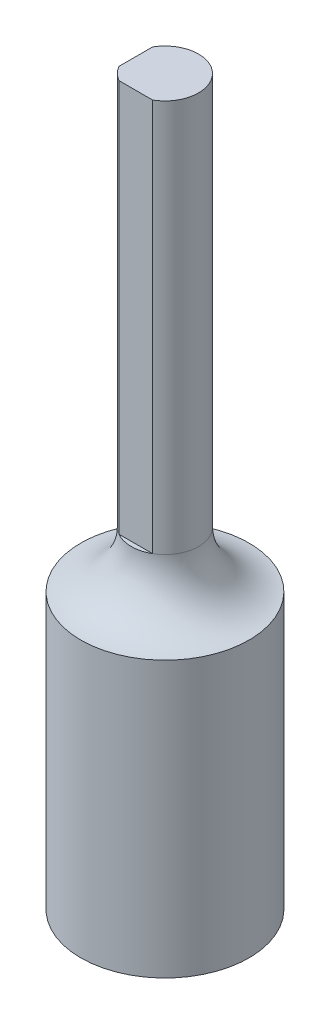
ISO-10303-21;
HEADER;
FILE_DESCRIPTION(('STEP AP214'),'2;1');
FILE_NAME('part.step','',(''),(''),'','','');
FILE_SCHEMA(('AUTOMOTIVE_DESIGN { 1 0 10303 214 1 1 1 1 }'));
ENDSEC;
DATA;
#1=APPLICATION_CONTEXT('core data for automotive mechanical design processes');
#2=APPLICATION_PROTOCOL_DEFINITION('international standard','automotive_design',2000,#1);
#3=PRODUCT_CONTEXT('',#1,'mechanical');
#4=PRODUCT('Part','Part','',(#3));
#5=PRODUCT_RELATED_PRODUCT_CATEGORY('part','',(#4));
#6=PRODUCT_DEFINITION_FORMATION('','',#4);
#7=PRODUCT_DEFINITION_CONTEXT('part definition',#1,'design');
#8=PRODUCT_DEFINITION('design','',#6,#7);
#9=PRODUCT_DEFINITION_SHAPE('','',#8);
#10=(LENGTH_UNIT() NAMED_UNIT(*) SI_UNIT(.MILLI.,.METRE.));
#11=(NAMED_UNIT(*) PLANE_ANGLE_UNIT() SI_UNIT($,.RADIAN.));
#12=(NAMED_UNIT(*) SI_UNIT($,.STERADIAN.) SOLID_ANGLE_UNIT());
#13=UNCERTAINTY_MEASURE_WITH_UNIT(LENGTH_MEASURE(1.E-05),#10,'distance_accuracy_value','');
#14=(GEOMETRIC_REPRESENTATION_CONTEXT(3) GLOBAL_UNCERTAINTY_ASSIGNED_CONTEXT((#13)) GLOBAL_UNIT_ASSIGNED_CONTEXT((#10,
#11,#12)) REPRESENTATION_CONTEXT('',''));
#15=CARTESIAN_POINT('',(0.,0.,0.));
#16=DIRECTION('',(0.,0.,1.));
#17=DIRECTION('',(1.,0.,0.));
#18=AXIS2_PLACEMENT_3D('',#15,#16,#17);
#19=CARTESIAN_POINT('',(0.,64.54,0.));
#20=DIRECTION('',(0.,-1.,0.));
#21=DIRECTION('',(0.,0.,-1.));
#22=AXIS2_PLACEMENT_3D('',#19,#20,#21);
#23=CYLINDRICAL_SURFACE('',#22,3.);
#24=CARTESIAN_POINT('',(0.,29.5149371855331,0.));
#25=DIRECTION('',(0.,-1.,0.));
#26=DIRECTION('',(0.,0.,-1.));
#27=AXIS2_PLACEMENT_3D('',#24,#25,#26);
#28=CIRCLE('',#27,3.);
#29=CARTESIAN_POINT('',(-2.6,29.5149371855331,1.49666295470958));
#30=VERTEX_POINT('',#29);
#31=CARTESIAN_POINT('',(-1.49666295470957,29.5149371855331,2.60000000000001));
#32=VERTEX_POINT('',#31);
#33=EDGE_CURVE('E51',#30,#32,#28,.F.);
#34=ORIENTED_EDGE('',*,*,#33,.T.);
#35=DIRECTION('',(0.,-1.,0.));
#36=VECTOR('',#35,1.);
#37=CARTESIAN_POINT('',(-1.49666295470957,64.54,2.60000000000001));
#38=LINE('',#37,#36);
#39=CARTESIAN_POINT('',(-1.49666295470957,64.54,2.60000000000001));
#40=VERTEX_POINT('',#39);
#41=EDGE_CURVE('E117',#32,#40,#38,.F.);
#42=ORIENTED_EDGE('',*,*,#41,.T.);
#43=CARTESIAN_POINT('',(0.,64.54,0.));
#44=DIRECTION('',(0.,1.,0.));
#45=DIRECTION('',(0.,0.,1.));
#46=AXIS2_PLACEMENT_3D('',#43,#44,#45);
#47=CIRCLE('',#46,3.);
#48=CARTESIAN_POINT('',(-2.6,64.54,1.49666295470958));
#49=VERTEX_POINT('',#48);
#50=EDGE_CURVE('E139',#49,#40,#47,.T.);
#51=ORIENTED_EDGE('',*,*,#50,.F.);
#52=DIRECTION('',(0.,-1.,0.));
#53=VECTOR('',#52,1.);
#54=CARTESIAN_POINT('',(-2.6,64.54,1.49666295470958));
#55=LINE('',#54,#53);
#56=EDGE_CURVE('E138',#49,#30,#55,.T.);
#57=ORIENTED_EDGE('',*,*,#56,.T.);
#58=EDGE_LOOP('',(#34,#42,#51,#57));
#59=FACE_BOUND('',#58,.T.);
#60=ADVANCED_FACE('F43',(#59),#23,.T.);
#61=CARTESIAN_POINT('',(0.,22.,0.));
#62=DIRECTION('',(0.,-1.,0.));
#63=DIRECTION('',(0.,0.,-1.));
#64=AXIS2_PLACEMENT_3D('',#61,#62,#63);
#65=CYLINDRICAL_SURFACE('',#64,4.005);
#66=CARTESIAN_POINT('',(0.,0.,0.));
#67=DIRECTION('',(0.,1.,0.));
#68=DIRECTION('',(0.,0.,1.));
#69=AXIS2_PLACEMENT_3D('',#66,#67,#68);
#70=CIRCLE('',#69,4.005);
#71=CARTESIAN_POINT('',(-1.52,0.,-3.70535086057987));
#72=VERTEX_POINT('',#71);
#73=CARTESIAN_POINT('',(1.52,0.,-3.70535086057987));
#74=VERTEX_POINT('',#73);
#75=EDGE_CURVE('E161',#72,#74,#70,.T.);
#76=ORIENTED_EDGE('',*,*,#75,.F.);
#77=DIRECTION('',(0.,-1.,0.));
#78=VECTOR('',#77,1.);
#79=CARTESIAN_POINT('',(-1.52,22.,-3.70535086057987));
#80=LINE('',#79,#78);
#81=CARTESIAN_POINT('',(-1.52,22.,-3.70535086057987));
#82=VERTEX_POINT('',#81);
#83=EDGE_CURVE('E91',#82,#72,#80,.T.);
#84=ORIENTED_EDGE('',*,*,#83,.F.);
#85=CARTESIAN_POINT('',(0.,22.,0.));
#86=DIRECTION('',(0.,1.,0.));
#87=DIRECTION('',(0.,0.,1.));
#88=AXIS2_PLACEMENT_3D('',#85,#86,#87);
#89=CIRCLE('',#88,4.005);
#90=CARTESIAN_POINT('',(1.52,22.,-3.70535086057987));
#91=VERTEX_POINT('',#90);
#92=EDGE_CURVE('E162',#82,#91,#89,.T.);
#93=ORIENTED_EDGE('',*,*,#92,.T.);
#94=DIRECTION('',(0.,-1.,0.));
#95=VECTOR('',#94,1.);
#96=CARTESIAN_POINT('',(1.52,22.,-3.70535086057987));
#97=LINE('',#96,#95);
#98=EDGE_CURVE('E88',#91,#74,#97,.T.);
#99=ORIENTED_EDGE('',*,*,#98,.T.);
#100=EDGE_LOOP('',(#76,#84,#93,#99));
#101=FACE_BOUND('',#100,.T.);
#102=ADVANCED_FACE('F192',(#101),#65,.F.);
#103=CARTESIAN_POINT('',(-1.52,22.,0.));
#104=DIRECTION('',(1.,0.,0.));
#105=DIRECTION('',(0.,0.,-1.));
#106=AXIS2_PLACEMENT_3D('',#103,#104,#105);
#107=PLANE('',#106);
#108=DIRECTION('',(0.,0.,1.));
#109=VECTOR('',#108,1.);
#110=CARTESIAN_POINT('',(-1.52,0.,0.));
#111=LINE('',#110,#109);
#112=CARTESIAN_POINT('',(-1.52,0.,-5.24));
#113=VERTEX_POINT('',#112);
#114=EDGE_CURVE('E175',#113,#72,#111,.T.);
#115=ORIENTED_EDGE('',*,*,#114,.F.);
#116=DIRECTION('',(0.,-1.,0.));
#117=VECTOR('',#116,1.);
#118=CARTESIAN_POINT('',(-1.52,22.,-5.24));
#119=LINE('',#118,#117);
#120=CARTESIAN_POINT('',(-1.52,22.,-5.24));
#121=VERTEX_POINT('',#120);
#122=EDGE_CURVE('E186',#121,#113,#119,.T.);
#123=ORIENTED_EDGE('',*,*,#122,.F.);
#124=DIRECTION('',(0.,0.,1.));
#125=VECTOR('',#124,1.);
#126=CARTESIAN_POINT('',(-1.52,22.,0.));
#127=LINE('',#126,#125);
#128=EDGE_CURVE('E164',#121,#82,#127,.T.);
#129=ORIENTED_EDGE('',*,*,#128,.T.);
#130=ORIENTED_EDGE('',*,*,#83,.T.);
#131=EDGE_LOOP('',(#115,#123,#129,#130));
#132=FACE_BOUND('',#131,.T.);
#133=ADVANCED_FACE('F189',(#132),#107,.T.);
#134=CARTESIAN_POINT('',(0.,22.,-5.24));
#135=DIRECTION('',(0.,0.,-1.));
#136=DIRECTION('',(-1.,0.,0.));
#137=AXIS2_PLACEMENT_3D('',#134,#135,#136);
#138=PLANE('',#137);
#139=DIRECTION('',(1.,0.,0.));
#140=VECTOR('',#139,1.);
#141=CARTESIAN_POINT('',(0.,0.,-5.24));
#142=LINE('',#141,#140);
#143=CARTESIAN_POINT('',(1.52,0.,-5.24));
#144=VERTEX_POINT('',#143);
#145=EDGE_CURVE('E178',#113,#144,#142,.T.);
#146=ORIENTED_EDGE('',*,*,#145,.T.);
#147=DIRECTION('',(0.,-1.,0.));
#148=VECTOR('',#147,1.);
#149=CARTESIAN_POINT('',(1.52,22.,-5.24));
#150=LINE('',#149,#148);
#151=CARTESIAN_POINT('',(1.52,22.,-5.24));
#152=VERTEX_POINT('',#151);
#153=EDGE_CURVE('E67',#152,#144,#150,.T.);
#154=ORIENTED_EDGE('',*,*,#153,.F.);
#155=DIRECTION('',(1.,0.,0.));
#156=VECTOR('',#155,1.);
#157=CARTESIAN_POINT('',(0.,22.,-5.24));
#158=LINE('',#157,#156);
#159=EDGE_CURVE('E167',#121,#152,#158,.T.);
#160=ORIENTED_EDGE('',*,*,#159,.F.);
#161=ORIENTED_EDGE('',*,*,#122,.T.);
#162=EDGE_LOOP('',(#146,#154,#160,#161));
#163=FACE_BOUND('',#162,.T.);
#164=ADVANCED_FACE('F198',(#163),#138,.F.);
#165=CARTESIAN_POINT('',(1.52,22.,0.));
#166=DIRECTION('',(1.,0.,0.));
#167=DIRECTION('',(0.,0.,-1.));
#168=AXIS2_PLACEMENT_3D('',#165,#166,#167);
#169=PLANE('',#168);
#170=DIRECTION('',(0.,0.,1.));
#171=VECTOR('',#170,1.);
#172=CARTESIAN_POINT('',(1.52,0.,0.));
#173=LINE('',#172,#171);
#174=EDGE_CURVE('E180',#144,#74,#173,.T.);
#175=ORIENTED_EDGE('',*,*,#174,.T.);
#176=ORIENTED_EDGE('',*,*,#98,.F.);
#177=DIRECTION('',(0.,0.,1.));
#178=VECTOR('',#177,1.);
#179=CARTESIAN_POINT('',(1.52,22.,0.));
#180=LINE('',#179,#178);
#181=EDGE_CURVE('E170',#152,#91,#180,.T.);
#182=ORIENTED_EDGE('',*,*,#181,.F.);
#183=ORIENTED_EDGE('',*,*,#153,.T.);
#184=EDGE_LOOP('',(#175,#176,#182,#183));
#185=FACE_BOUND('',#184,.T.);
#186=ADVANCED_FACE('F200',(#185),#169,.F.);
#187=CARTESIAN_POINT('',(0.,22.,0.));
#188=DIRECTION('',(0.,-1.,0.));
#189=DIRECTION('',(0.,0.,-1.));
#190=AXIS2_PLACEMENT_3D('',#187,#188,#189);
#191=CYLINDRICAL_SURFACE('',#190,7.5);
#192=CARTESIAN_POINT('',(0.,0.,0.));
#193=DIRECTION('',(0.,1.,0.));
#194=DIRECTION('',(0.,0.,1.));
#195=AXIS2_PLACEMENT_3D('',#192,#193,#194);
#196=CIRCLE('',#195,7.5);
#197=CARTESIAN_POINT('',(0.,0.,7.5));
#198=VERTEX_POINT('',#197);
#199=EDGE_CURVE('E165',#198,#198,#196,.T.);
#200=ORIENTED_EDGE('',*,*,#199,.T.);
#201=EDGE_LOOP('',(#200));
#202=FACE_BOUND('',#201,.T.);
#203=CARTESIAN_POINT('',(0.,24.54,0.));
#204=DIRECTION('',(0.,1.,0.));
#205=DIRECTION('',(0.,0.,1.));
#206=AXIS2_PLACEMENT_3D('',#203,#204,#205);
#207=CIRCLE('',#206,7.5);
#208=CARTESIAN_POINT('',(0.,24.54,7.5));
#209=VERTEX_POINT('',#208);
#210=EDGE_CURVE('E158',#209,#209,#207,.T.);
#211=ORIENTED_EDGE('',*,*,#210,.F.);
#212=EDGE_LOOP('',(#211));
#213=FACE_BOUND('',#212,.T.);
#214=ADVANCED_FACE('F215',(#202,#213),#191,.T.);
#215=CARTESIAN_POINT('',(0.,0.,0.));
#216=DIRECTION('',(0.,1.,0.));
#217=DIRECTION('',(0.,0.,1.));
#218=AXIS2_PLACEMENT_3D('',#215,#216,#217);
#219=PLANE('',#218);
#220=ORIENTED_EDGE('',*,*,#75,.T.);
#221=ORIENTED_EDGE('',*,*,#174,.F.);
#222=ORIENTED_EDGE('',*,*,#145,.F.);
#223=ORIENTED_EDGE('',*,*,#114,.T.);
#224=EDGE_LOOP('',(#220,#221,#222,#223));
#225=FACE_BOUND('',#224,.T.);
#226=ORIENTED_EDGE('',*,*,#199,.F.);
#227=EDGE_LOOP('',(#226));
#228=FACE_BOUND('',#227,.T.);
#229=ADVANCED_FACE('F196',(#225,#228),#219,.F.);
#230=CARTESIAN_POINT('',(0.,22.,0.));
#231=DIRECTION('',(0.,1.,0.));
#232=DIRECTION('',(0.,0.,1.));
#233=AXIS2_PLACEMENT_3D('',#230,#231,#232);
#234=PLANE('',#233);
#235=CARTESIAN_POINT('',(0.,22.,0.));
#236=DIRECTION('',(0.,1.,0.));
#237=DIRECTION('',(0.,0.,1.));
#238=AXIS2_PLACEMENT_3D('',#235,#236,#237);
#239=CIRCLE('',#238,1.7);
#240=CARTESIAN_POINT('',(0.,22.,1.7));
#241=VERTEX_POINT('',#240);
#242=EDGE_CURVE('E155',#241,#241,#239,.T.);
#243=ORIENTED_EDGE('',*,*,#242,.T.);
#244=EDGE_LOOP('',(#243));
#245=FACE_BOUND('',#244,.T.);
#246=ORIENTED_EDGE('',*,*,#92,.F.);
#247=ORIENTED_EDGE('',*,*,#128,.F.);
#248=ORIENTED_EDGE('',*,*,#159,.T.);
#249=ORIENTED_EDGE('',*,*,#181,.T.);
#250=EDGE_LOOP('',(#246,#247,#248,#249));
#251=FACE_BOUND('',#250,.T.);
#252=ADVANCED_FACE('F202',(#245,#251),#234,.F.);
#253=CARTESIAN_POINT('',(0.,24.54,0.));
#254=DIRECTION('',(0.,1.,0.));
#255=DIRECTION('',(0.,0.,1.));
#256=AXIS2_PLACEMENT_3D('',#253,#254,#255);
#257=CYLINDRICAL_SURFACE('',#256,1.7);
#258=ORIENTED_EDGE('',*,*,#242,.F.);
#259=EDGE_LOOP('',(#258));
#260=FACE_BOUND('',#259,.T.);
#261=CARTESIAN_POINT('',(0.,24.54,0.));
#262=DIRECTION('',(0.,1.,0.));
#263=DIRECTION('',(0.,0.,1.));
#264=AXIS2_PLACEMENT_3D('',#261,#262,#263);
#265=CIRCLE('',#264,1.7);
#266=CARTESIAN_POINT('',(0.,24.54,1.7));
#267=VERTEX_POINT('',#266);
#268=EDGE_CURVE('E152',#267,#267,#265,.F.);
#269=ORIENTED_EDGE('',*,*,#268,.F.);
#270=EDGE_LOOP('',(#269));
#271=FACE_BOUND('',#270,.T.);
#272=ADVANCED_FACE('F204',(#260,#271),#257,.F.);
#273=CARTESIAN_POINT('',(0.,24.54,0.));
#274=DIRECTION('',(0.,1.,0.));
#275=DIRECTION('',(0.,0.,1.));
#276=AXIS2_PLACEMENT_3D('',#273,#274,#275);
#277=PLANE('',#276);
#278=ORIENTED_EDGE('',*,*,#268,.T.);
#279=EDGE_LOOP('',(#278));
#280=FACE_BOUND('',#279,.T.);
#281=ADVANCED_FACE('F211',(#280),#277,.F.);
#282=CARTESIAN_POINT('',(1.49666295470959,64.54,2.6));
#283=VERTEX_POINT('',#282);
#284=CARTESIAN_POINT('',(-2.6,64.54,-1.49666295470958));
#285=VERTEX_POINT('',#284);
#286=EDGE_CURVE('E144',#283,#285,#47,.T.);
#287=ORIENTED_EDGE('',*,*,#286,.F.);
#288=DIRECTION('',(0.,-1.,0.));
#289=VECTOR('',#288,1.);
#290=CARTESIAN_POINT('',(1.49666295470959,64.54,2.6));
#291=LINE('',#290,#289);
#292=CARTESIAN_POINT('',(1.49666295470958,29.5149371855331,2.6));
#293=VERTEX_POINT('',#292);
#294=EDGE_CURVE('E127',#283,#293,#291,.T.);
#295=ORIENTED_EDGE('',*,*,#294,.T.);
#296=CARTESIAN_POINT('',(-2.6,29.5149371855331,-1.49666295470958));
#297=VERTEX_POINT('',#296);
#298=EDGE_CURVE('E52',#293,#297,#28,.F.);
#299=ORIENTED_EDGE('',*,*,#298,.T.);
#300=DIRECTION('',(0.,-1.,0.));
#301=VECTOR('',#300,1.);
#302=CARTESIAN_POINT('',(-2.6,64.54,-1.49666295470958));
#303=LINE('',#302,#301);
#304=EDGE_CURVE('E145',#297,#285,#303,.F.);
#305=ORIENTED_EDGE('',*,*,#304,.T.);
#306=EDGE_LOOP('',(#287,#295,#299,#305));
#307=FACE_BOUND('',#306,.T.);
#308=ADVANCED_FACE('F219',(#307),#23,.T.);
#309=CARTESIAN_POINT('',(0.,64.54,0.));
#310=DIRECTION('',(0.,1.,0.));
#311=DIRECTION('',(0.,0.,1.));
#312=AXIS2_PLACEMENT_3D('',#309,#310,#311);
#313=PLANE('',#312);
#314=DIRECTION('',(-1.,0.,0.));
#315=VECTOR('',#314,1.);
#316=CARTESIAN_POINT('',(0.,64.54,2.6));
#317=LINE('',#316,#315);
#318=EDGE_CURVE('E122',#283,#40,#317,.T.);
#319=ORIENTED_EDGE('',*,*,#318,.F.);
#320=ORIENTED_EDGE('',*,*,#286,.T.);
#321=DIRECTION('',(0.,0.,-1.));
#322=VECTOR('',#321,1.);
#323=CARTESIAN_POINT('',(-2.6,64.54,0.));
#324=LINE('',#323,#322);
#325=EDGE_CURVE('E148',#49,#285,#324,.T.);
#326=ORIENTED_EDGE('',*,*,#325,.F.);
#327=ORIENTED_EDGE('',*,*,#50,.T.);
#328=EDGE_LOOP('',(#319,#320,#326,#327));
#329=FACE_BOUND('',#328,.T.);
#330=ADVANCED_FACE('F226',(#329),#313,.T.);
#331=CARTESIAN_POINT('',(0.,29.5149371855331,0.));
#332=DIRECTION('',(0.,-1.,0.));
#333=DIRECTION('',(0.,0.,-1.));
#334=AXIS2_PLACEMENT_3D('',#331,#332,#333);
#335=TOROIDAL_SURFACE('',#334,8.,5.);
#336=ORIENTED_EDGE('',*,*,#210,.T.);
#337=EDGE_LOOP('',(#336));
#338=FACE_BOUND('',#337,.T.);
#339=EDGE_CURVE('E11',#297,#30,#28,.F.);
#340=ORIENTED_EDGE('',*,*,#339,.F.);
#341=ORIENTED_EDGE('',*,*,#298,.F.);
#342=EDGE_CURVE('E132',#32,#293,#28,.F.);
#343=ORIENTED_EDGE('',*,*,#342,.F.);
#344=ORIENTED_EDGE('',*,*,#33,.F.);
#345=EDGE_LOOP('',(#340,#341,#343,#344));
#346=FACE_BOUND('',#345,.T.);
#347=ADVANCED_FACE('F45',(#338,#346),#335,.F.);
#348=CARTESIAN_POINT('',(-2.6,29.5149371855331,-7.5));
#349=DIRECTION('',(0.,-1.,0.));
#350=DIRECTION('',(0.,0.,-1.));
#351=AXIS2_PLACEMENT_3D('',#348,#349,#350);
#352=PLANE('',#351);
#353=DIRECTION('',(0.,0.,1.));
#354=VECTOR('',#353,1.);
#355=CARTESIAN_POINT('',(-2.6,29.5149371855331,-7.5));
#356=LINE('',#355,#354);
#357=EDGE_CURVE('E237',#297,#30,#356,.T.);
#358=ORIENTED_EDGE('',*,*,#357,.F.);
#359=ORIENTED_EDGE('',*,*,#339,.T.);
#360=EDGE_LOOP('',(#358,#359));
#361=FACE_BOUND('',#360,.T.);
#362=ADVANCED_FACE('F242',(#361),#352,.F.);
#363=CARTESIAN_POINT('',(-2.6,0.,0.));
#364=DIRECTION('',(1.,0.,0.));
#365=DIRECTION('',(0.,0.,-1.));
#366=AXIS2_PLACEMENT_3D('',#363,#364,#365);
#367=PLANE('',#366);
#368=ORIENTED_EDGE('',*,*,#325,.T.);
#369=ORIENTED_EDGE('',*,*,#304,.F.);
#370=ORIENTED_EDGE('',*,*,#357,.T.);
#371=ORIENTED_EDGE('',*,*,#56,.F.);
#372=EDGE_LOOP('',(#368,#369,#370,#371));
#373=FACE_BOUND('',#372,.T.);
#374=ADVANCED_FACE('F236',(#373),#367,.F.);
#375=CARTESIAN_POINT('',(-7.49999999999999,29.5149371855331,2.60000000000003));
#376=DIRECTION('',(0.,-1.,0.));
#377=DIRECTION('',(0.,0.,-1.));
#378=AXIS2_PLACEMENT_3D('',#375,#376,#377);
#379=PLANE('',#378);
#380=ORIENTED_EDGE('',*,*,#342,.T.);
#381=DIRECTION('',(1.,0.,0.));
#382=VECTOR('',#381,1.);
#383=CARTESIAN_POINT('',(-7.49999999999999,29.5149371855331,2.60000000000003));
#384=LINE('',#383,#382);
#385=EDGE_CURVE('E120',#32,#293,#384,.T.);
#386=ORIENTED_EDGE('',*,*,#385,.F.);
#387=EDGE_LOOP('',(#380,#386));
#388=FACE_BOUND('',#387,.T.);
#389=ADVANCED_FACE('F131',(#388),#379,.F.);
#390=CARTESIAN_POINT('',(0.,0.,2.6));
#391=DIRECTION('',(0.,0.,-1.));
#392=DIRECTION('',(-1.,0.,0.));
#393=AXIS2_PLACEMENT_3D('',#390,#391,#392);
#394=PLANE('',#393);
#395=ORIENTED_EDGE('',*,*,#318,.T.);
#396=ORIENTED_EDGE('',*,*,#41,.F.);
#397=ORIENTED_EDGE('',*,*,#385,.T.);
#398=ORIENTED_EDGE('',*,*,#294,.F.);
#399=EDGE_LOOP('',(#395,#396,#397,#398));
#400=FACE_BOUND('',#399,.T.);
#401=ADVANCED_FACE('F119',(#400),#394,.F.);
#402=CLOSED_SHELL('',(#60,#102,#133,#164,#186,#214,#229,#252,#272,#281,#308,#330,#347,#362,#374,
#389,#401));
#403=MANIFOLD_SOLID_BREP('B2',#402);
#404=ADVANCED_BREP_SHAPE_REPRESENTATION('',(#18,#403),#14);
#405=SHAPE_DEFINITION_REPRESENTATION(#9,#404);
ENDSEC;
END-ISO-10303-21;
